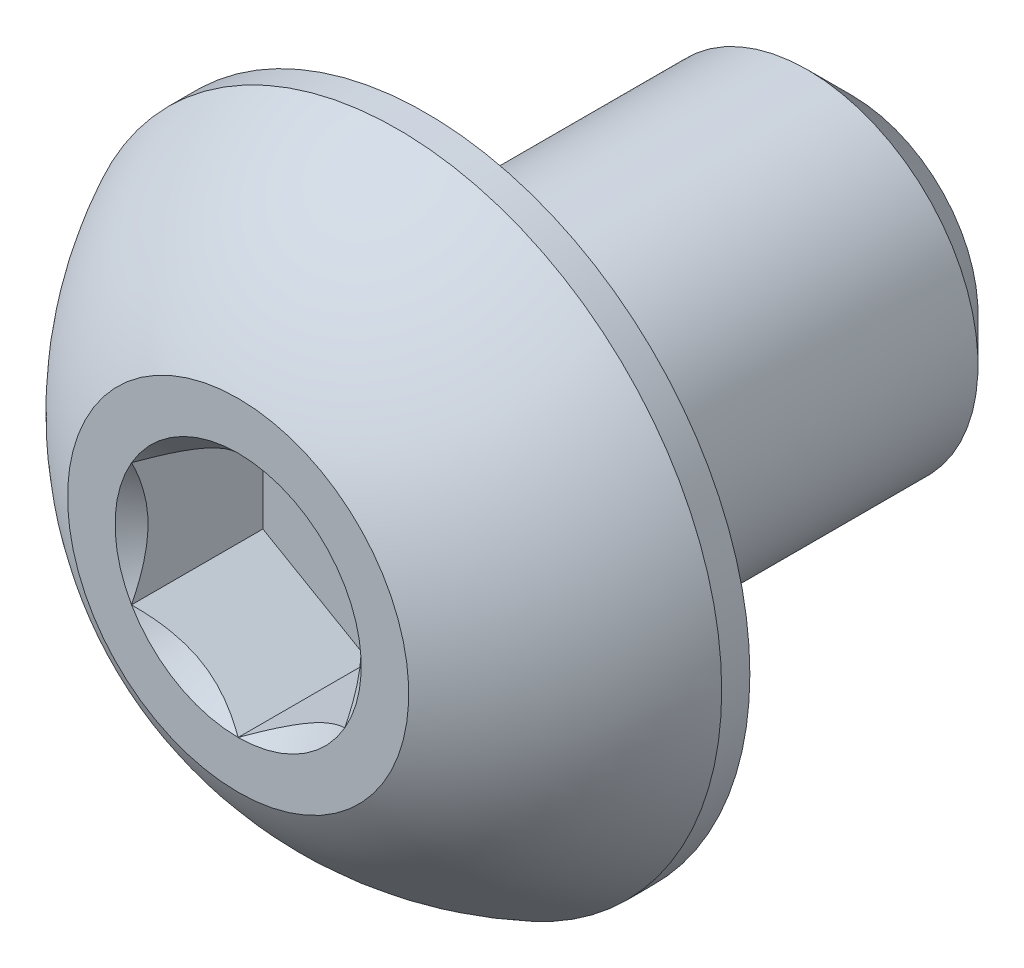
ISO-10303-21;
HEADER;
FILE_DESCRIPTION(('STEP AP214'),'2;1');
FILE_NAME('part.step','',(''),(''),'','','');
FILE_SCHEMA(('AUTOMOTIVE_DESIGN { 1 0 10303 214 1 1 1 1 }'));
ENDSEC;
DATA;
#1=APPLICATION_CONTEXT('core data for automotive mechanical design processes');
#2=APPLICATION_PROTOCOL_DEFINITION('international standard','automotive_design',2000,#1);
#3=PRODUCT_CONTEXT('',#1,'mechanical');
#4=PRODUCT('Part','Part','',(#3));
#5=PRODUCT_RELATED_PRODUCT_CATEGORY('part','',(#4));
#6=PRODUCT_DEFINITION_FORMATION('','',#4);
#7=PRODUCT_DEFINITION_CONTEXT('part definition',#1,'design');
#8=PRODUCT_DEFINITION('design','',#6,#7);
#9=PRODUCT_DEFINITION_SHAPE('','',#8);
#10=(LENGTH_UNIT() NAMED_UNIT(*) SI_UNIT(.MILLI.,.METRE.));
#11=(NAMED_UNIT(*) PLANE_ANGLE_UNIT() SI_UNIT($,.RADIAN.));
#12=(NAMED_UNIT(*) SI_UNIT($,.STERADIAN.) SOLID_ANGLE_UNIT());
#13=UNCERTAINTY_MEASURE_WITH_UNIT(LENGTH_MEASURE(1.E-05),#10,'distance_accuracy_value','');
#14=(GEOMETRIC_REPRESENTATION_CONTEXT(3) GLOBAL_UNCERTAINTY_ASSIGNED_CONTEXT((#13)) GLOBAL_UNIT_ASSIGNED_CONTEXT((#10,
#11,#12)) REPRESENTATION_CONTEXT('',''));
#15=CARTESIAN_POINT('',(0.,0.,0.));
#16=DIRECTION('',(0.,0.,1.));
#17=DIRECTION('',(1.,0.,0.));
#18=AXIS2_PLACEMENT_3D('',#15,#16,#17);
#19=CARTESIAN_POINT('',(0.,-2.,-7.2));
#20=DIRECTION('',(0.,0.,-1.));
#21=DIRECTION('',(0.,1.,0.));
#22=AXIS2_PLACEMENT_3D('',#19,#20,#21);
#23=PLANE('',#22);
#24=CARTESIAN_POINT('',(0.,0.,-7.2));
#25=DIRECTION('',(0.,0.,-1.));
#26=DIRECTION('',(0.,1.,0.));
#27=AXIS2_PLACEMENT_3D('',#24,#25,#26);
#28=CIRCLE('',#27,1.475);
#29=CARTESIAN_POINT('',(0.,1.475,-7.2));
#30=VERTEX_POINT('',#29);
#31=EDGE_CURVE('E177',#30,#30,#28,.T.);
#32=ORIENTED_EDGE('',*,*,#31,.T.);
#33=EDGE_LOOP('',(#32));
#34=FACE_BOUND('',#33,.T.);
#35=ADVANCED_FACE('F37',(#34),#23,.T.);
#36=CARTESIAN_POINT('',(0.,0.,-7.2));
#37=DIRECTION('',(0.,0.,-1.));
#38=DIRECTION('',(0.,1.,0.));
#39=AXIS2_PLACEMENT_3D('',#36,#37,#38);
#40=CYLINDRICAL_SURFACE('',#39,2.);
#41=CARTESIAN_POINT('',(0.,0.,-6.675));
#42=DIRECTION('',(0.,0.,-1.));
#43=DIRECTION('',(0.,1.,0.));
#44=AXIS2_PLACEMENT_3D('',#41,#42,#43);
#45=CIRCLE('',#44,2.);
#46=CARTESIAN_POINT('',(0.,2.,-6.675));
#47=VERTEX_POINT('',#46);
#48=EDGE_CURVE('E51',#47,#47,#45,.F.);
#49=ORIENTED_EDGE('',*,*,#48,.T.);
#50=EDGE_LOOP('',(#49));
#51=FACE_BOUND('',#50,.T.);
#52=CARTESIAN_POINT('',(0.,0.,-2.2));
#53=DIRECTION('',(0.,0.,1.));
#54=DIRECTION('',(1.,0.,0.));
#55=AXIS2_PLACEMENT_3D('',#52,#53,#54);
#56=CIRCLE('',#55,2.);
#57=CARTESIAN_POINT('',(2.,0.,-2.2));
#58=VERTEX_POINT('',#57);
#59=EDGE_CURVE('E174',#58,#58,#56,.F.);
#60=ORIENTED_EDGE('',*,*,#59,.T.);
#61=EDGE_LOOP('',(#60));
#62=FACE_BOUND('',#61,.T.);
#63=ADVANCED_FACE('F182',(#51,#62),#40,.T.);
#64=CARTESIAN_POINT('',(0.,0.,-7.2));
#65=DIRECTION('',(0.,0.,1.));
#66=DIRECTION('',(0.,-1.,0.));
#67=AXIS2_PLACEMENT_3D('',#64,#65,#66);
#68=CONICAL_SURFACE('',#67,1.475,0.785398163397447);
#69=ORIENTED_EDGE('',*,*,#48,.F.);
#70=EDGE_LOOP('',(#69));
#71=FACE_BOUND('',#70,.T.);
#72=ORIENTED_EDGE('',*,*,#31,.F.);
#73=EDGE_LOOP('',(#72));
#74=FACE_BOUND('',#73,.T.);
#75=ADVANCED_FACE('F39',(#71,#74),#68,.T.);
#76=CARTESIAN_POINT('',(0.,0.,-3.72644385026738));
#77=DIRECTION('',(0.,0.,1.));
#78=DIRECTION('',(0.,-1.,0.));
#79=AXIS2_PLACEMENT_3D('',#76,#77,#78);
#80=SPHERICAL_SURFACE('',#79,4.22922968981298);
#81=CARTESIAN_POINT('',(0.,0.,0.));
#82=DIRECTION('',(0.,0.,1.));
#83=DIRECTION('',(1.,0.,0.));
#84=AXIS2_PLACEMENT_3D('',#81,#82,#83);
#85=CIRCLE('',#84,2.);
#86=CARTESIAN_POINT('',(0.,-2.,0.));
#87=VERTEX_POINT('',#86);
#88=EDGE_CURVE('E171',#87,#87,#85,.T.);
#89=CARTESIAN_POINT('',(0.,0.,-1.87));
#90=DIRECTION('',(0.,0.,1.));
#91=DIRECTION('',(1.,0.,0.));
#92=AXIS2_PLACEMENT_3D('',#89,#90,#91);
#93=CIRCLE('',#92,3.8);
#94=CARTESIAN_POINT('',(0.,-3.8,-1.87));
#95=VERTEX_POINT('',#94);
#96=EDGE_CURVE('E165',#95,#95,#93,.T.);
#97=CARTESIAN_POINT('',(0.,-2.,0.));
#98=CARTESIAN_POINT('',(0.,-2.02421343985614,-0.0129954259644875));
#99=CARTESIAN_POINT('',(0.,-2.04830018323974,-0.0262269129651304));
#100=CARTESIAN_POINT('',(0.,-2.09621120342126,-0.0531568415057494));
#101=CARTESIAN_POINT('',(0.,-2.12003548021917,-0.0668552830457255));
#102=CARTESIAN_POINT('',(0.,-2.16741249358867,-0.0947139531320317));
#103=CARTESIAN_POINT('',(0.,-2.19096523016026,-0.108874181678362));
#104=CARTESIAN_POINT('',(0.,-2.23779021933683,-0.137651035235957));
#105=CARTESIAN_POINT('',(0.,-2.26106247194181,-0.152267660247222));
#106=CARTESIAN_POINT('',(0.,-2.30731764886072,-0.181951755514141));
#107=CARTESIAN_POINT('',(0.,-2.33030057317465,-0.197019225769796));
#108=CARTESIAN_POINT('',(0.,-2.37596836104235,-0.227599285582871));
#109=CARTESIAN_POINT('',(0.,-2.39865322459612,-0.243111875140292));
#110=CARTESIAN_POINT('',(0.,-2.44371627121513,-0.274576279395883));
#111=CARTESIAN_POINT('',(0.,-2.46609445428038,-0.290528094094053));
#112=CARTESIAN_POINT('',(0.,-2.51053563686181,-0.322864887331672));
#113=CARTESIAN_POINT('',(0.,-2.53259863637801,-0.339249865871121));
#114=CARTESIAN_POINT('',(0.,-2.57640106852492,-0.372446760967231));
#115=CARTESIAN_POINT('',(0.,-2.59814050115564,-0.389258677523892));
#116=CARTESIAN_POINT('',(0.,-2.64128753915153,-0.423303060588147));
#117=CARTESIAN_POINT('',(0.,-2.66269514451671,-0.440535527095742));
#118=CARTESIAN_POINT('',(0.,-2.70517039368395,-0.475414462202967));
#119=CARTESIAN_POINT('',(0.,-2.72623803748602,-0.493060930802597));
#120=CARTESIAN_POINT('',(0.,-2.76802535840619,-0.528761164924409));
#121=CARTESIAN_POINT('',(0.,-2.78874503552428,-0.54681493044659));
#122=CARTESIAN_POINT('',(0.,-2.82982855017313,-0.583322898482807));
#123=CARTESIAN_POINT('',(0.,-2.85019238770389,-0.601777100996844));
#124=CARTESIAN_POINT('',(0.,-2.89055648548394,-0.639078930931023));
#125=CARTESIAN_POINT('',(0.,-2.91055674573324,-0.657926558351166));
#126=CARTESIAN_POINT('',(0.,-2.95018608940553,-0.696008076521266));
#127=CARTESIAN_POINT('',(0.,-2.96981517282852,-0.715241967271224));
#128=CARTESIAN_POINT('',(0.,-3.00869470434027,-0.754088703755294));
#129=CARTESIAN_POINT('',(0.,-3.02794515242903,-0.773701549489405));
#130=CARTESIAN_POINT('',(0.,-3.06606009863533,-0.813298743603725));
#131=CARTESIAN_POINT('',(0.,-3.08492459675287,-0.833283091983934));
#132=CARTESIAN_POINT('',(0.,-3.12226047503002,-0.873615697891678));
#133=CARTESIAN_POINT('',(0.,-3.14073185518965,-0.893963955419212));
#134=CARTESIAN_POINT('',(0.,-3.17727447893821,-0.935016647847443));
#135=CARTESIAN_POINT('',(0.,-3.19534572252715,-0.955721082748139));
#136=CARTESIAN_POINT('',(0.,-3.23108120656242,-0.997478262810989));
#137=CARTESIAN_POINT('',(0.,-3.24874544700875,-1.01853100797314));
#138=CARTESIAN_POINT('',(0.,-3.28366021283673,-1.06097680909897));
#139=CARTESIAN_POINT('',(0.,-3.30091073821839,-1.08236986506264));
#140=CARTESIAN_POINT('',(0.,-3.33499151919534,-1.12548815902283));
#141=CARTESIAN_POINT('',(0.,-3.35182177479064,-1.14721339701936));
#142=CARTESIAN_POINT('',(0.,-3.38505562116371,-1.1909878000568));
#143=CARTESIAN_POINT('',(0.,-3.40145921194149,-1.21303696509771));
#144=CARTESIAN_POINT('',(0.,-3.43383349577047,-1.25745084415152));
#145=CARTESIAN_POINT('',(0.,-3.44980418882166,-1.27981555816441));
#146=CARTESIAN_POINT('',(0.,-3.48130660877275,-1.32485203719233));
#147=CARTESIAN_POINT('',(0.,-3.49683833567264,-1.34752380220736));
#148=CARTESIAN_POINT('',(0.,-3.52745692170931,-1.39316576858967));
#149=CARTESIAN_POINT('',(0.,-3.5425437808461,-1.41613596995694));
#150=CARTESIAN_POINT('',(0.,-3.57226689871518,-1.46236608103065));
#151=CARTESIAN_POINT('',(0.,-3.58690315744748,-1.48562599073709));
#152=CARTESIAN_POINT('',(0.,-3.61571951333199,-1.5324266802666));
#153=CARTESIAN_POINT('',(0.,-3.62989961048422,-1.55596746008967));
#154=CARTESIAN_POINT('',(0.,-3.65779825442823,-1.6033209453859));
#155=CARTESIAN_POINT('',(0.,-3.67151680122002,-1.62713365085906));
#156=CARTESIAN_POINT('',(0.,-3.69848713452321,-1.67502193787766));
#157=CARTESIAN_POINT('',(0.,-3.71173892103461,-1.6990975194231));
#158=CARTESIAN_POINT('',(0.,-3.73777068821038,-1.74750241579215));
#159=CARTESIAN_POINT('',(0.,-3.75055066887474,-1.77183173061575));
#160=CARTESIAN_POINT('',(0.,-3.77563400658953,-1.82073482944519));
#161=CARTESIAN_POINT('',(0.,-3.78793736363997,-1.84530861345103));
#162=CARTESIAN_POINT('',(0.,-3.8,-1.87));
#163=B_SPLINE_CURVE_WITH_KNOTS('',3,(#97,#98,#99,#100,#101,#102,#103,#104,#105,#106,#107,#108,
#109,#110,#111,#112,#113,#114,#115,#116,#117,#118,#119,#120,#121,#122,#123,#124,#125,#126,#127,
#128,#129,#130,#131,#132,#133,#134,#135,#136,#137,#138,#139,#140,#141,#142,#143,#144,#145,#146,
#147,#148,#149,#150,#151,#152,#153,#154,#155,#156,#157,#158,#159,#160,#161,#162),.UNSPECIFIED.,
.F.,.F.,(4,2,2,2,2,2,2,2,2,2,2,2,2,2,2,2,2,2,2,2,2,2,2,2,2,2,2,2,2,2,2,2,4),(0.,
0.082439858910264,0.164879717820529,0.247319576730793,0.329759435641057,0.412199294551322,
0.494639153461586,0.57707901237185,0.659518871282114,0.741958730192378,0.824398589102643,
0.906838448012907,0.989278306923171,1.07171816583344,1.1541580247437,1.23659788365396,
1.31903774256423,1.40147760147449,1.48391746038476,1.56635731929502,1.64879717820529,
1.73123703711555,1.81367689602581,1.89611675493608,1.97855661384634,2.06099647275661,
2.14343633166687,2.22587619057714,2.3083160494874,2.39075590839766,2.47319576730793,
2.55563562621819,2.63807548512846),.UNSPECIFIED.);
#164=EDGE_CURVE('BSEAM187',#87,#95,#163,.T.);
#165=ORIENTED_EDGE('',*,*,#88,.F.);
#166=ORIENTED_EDGE('',*,*,#96,.T.);
#167=ORIENTED_EDGE('',*,*,#164,.T.);
#168=ORIENTED_EDGE('',*,*,#164,.F.);
#169=EDGE_LOOP('',(#165,#167,#166,#168));
#170=FACE_BOUND('',#169,.T.);
#171=ADVANCED_FACE('F187',(#170),#80,.T.);
#172=CARTESIAN_POINT('',(0.,-2.,0.));
#173=DIRECTION('',(0.,0.,-1.));
#174=DIRECTION('',(-1.,0.,0.));
#175=AXIS2_PLACEMENT_3D('',#172,#173,#174);
#176=PLANE('',#175);
#177=CARTESIAN_POINT('',(0.,0.,0.));
#178=DIRECTION('',(0.,0.,1.));
#179=DIRECTION('',(1.,0.,0.));
#180=AXIS2_PLACEMENT_3D('',#177,#178,#179);
#181=CIRCLE('',#180,1.44337567297406);
#182=CARTESIAN_POINT('',(-1.25,0.721687836487032,0.));
#183=VERTEX_POINT('',#182);
#184=CARTESIAN_POINT('',(-1.25,-0.721687836487033,0.));
#185=VERTEX_POINT('',#184);
#186=EDGE_CURVE('E64',#183,#185,#181,.T.);
#187=ORIENTED_EDGE('',*,*,#186,.F.);
#188=CARTESIAN_POINT('',(0.,1.44337567297406,0.));
#189=VERTEX_POINT('',#188);
#190=EDGE_CURVE('E136',#189,#183,#181,.T.);
#191=ORIENTED_EDGE('',*,*,#190,.F.);
#192=CARTESIAN_POINT('',(1.25,0.721687836487033,0.));
#193=VERTEX_POINT('',#192);
#194=EDGE_CURVE('E133',#193,#189,#181,.T.);
#195=ORIENTED_EDGE('',*,*,#194,.F.);
#196=CARTESIAN_POINT('',(1.25,-0.721687836487033,0.));
#197=VERTEX_POINT('',#196);
#198=EDGE_CURVE('E104',#197,#193,#181,.T.);
#199=ORIENTED_EDGE('',*,*,#198,.F.);
#200=CARTESIAN_POINT('',(0.,-1.44337567297406,0.));
#201=VERTEX_POINT('',#200);
#202=EDGE_CURVE('E96',#201,#197,#181,.T.);
#203=ORIENTED_EDGE('',*,*,#202,.F.);
#204=EDGE_CURVE('E57',#185,#201,#181,.T.);
#205=ORIENTED_EDGE('',*,*,#204,.F.);
#206=EDGE_LOOP('',(#187,#191,#195,#199,#203,#205));
#207=FACE_BOUND('',#206,.T.);
#208=ORIENTED_EDGE('',*,*,#88,.T.);
#209=EDGE_LOOP('',(#208));
#210=FACE_BOUND('',#209,.T.);
#211=ADVANCED_FACE('F130',(#207,#210),#176,.F.);
#212=CARTESIAN_POINT('',(0.,-3.8,-2.2));
#213=DIRECTION('',(0.,0.,1.));
#214=DIRECTION('',(1.,0.,0.));
#215=AXIS2_PLACEMENT_3D('',#212,#213,#214);
#216=PLANE('',#215);
#217=ORIENTED_EDGE('',*,*,#59,.F.);
#218=EDGE_LOOP('',(#217));
#219=FACE_BOUND('',#218,.T.);
#220=CARTESIAN_POINT('',(0.,0.,-2.2));
#221=DIRECTION('',(0.,0.,1.));
#222=DIRECTION('',(1.,0.,0.));
#223=AXIS2_PLACEMENT_3D('',#220,#221,#222);
#224=CIRCLE('',#223,3.8);
#225=CARTESIAN_POINT('',(3.8,0.,-2.2));
#226=VERTEX_POINT('',#225);
#227=EDGE_CURVE('E168',#226,#226,#224,.T.);
#228=ORIENTED_EDGE('',*,*,#227,.F.);
#229=EDGE_LOOP('',(#228));
#230=FACE_BOUND('',#229,.T.);
#231=ADVANCED_FACE('F201',(#219,#230),#216,.F.);
#232=CARTESIAN_POINT('',(0.,0.,0.));
#233=DIRECTION('',(0.,0.,1.));
#234=DIRECTION('',(1.,0.,0.));
#235=AXIS2_PLACEMENT_3D('',#232,#233,#234);
#236=CYLINDRICAL_SURFACE('',#235,3.8);
#237=ORIENTED_EDGE('',*,*,#96,.F.);
#238=EDGE_LOOP('',(#237));
#239=FACE_BOUND('',#238,.T.);
#240=ORIENTED_EDGE('',*,*,#227,.T.);
#241=EDGE_LOOP('',(#240));
#242=FACE_BOUND('',#241,.T.);
#243=ADVANCED_FACE('F204',(#239,#242),#236,.T.);
#244=CARTESIAN_POINT('',(0.,0.,0.));
#245=DIRECTION('',(0.,0.,1.));
#246=DIRECTION('',(1.,0.,0.));
#247=AXIS2_PLACEMENT_3D('',#244,#245,#246);
#248=CONICAL_SURFACE('',#247,1.44337567297406,0.78539816339745);
#249=ORIENTED_EDGE('',*,*,#198,.T.);
#250=CARTESIAN_POINT('',(1.25,-1.43934010808077,0.462982096892326));
#251=CARTESIAN_POINT('',(1.25,-1.40429313005659,0.436524922632888));
#252=CARTESIAN_POINT('',(1.25,-1.36905087135599,0.410327160354278));
#253=CARTESIAN_POINT('',(1.25,-1.29809650706311,0.358557571839583));
#254=CARTESIAN_POINT('',(1.25,-1.26238428576495,0.332985904356292));
#255=CARTESIAN_POINT('',(1.25,-1.15390111792708,0.257005993689463));
#256=CARTESIAN_POINT('',(1.25,-1.08031646726264,0.207740286189565));
#257=CARTESIAN_POINT('',(1.25,-0.926012322755094,0.111025830263131));
#258=CARTESIAN_POINT('',(1.25,-0.845125318656146,0.0638412989417953));
#259=CARTESIAN_POINT('',(1.25,-0.679311174076601,-0.0224692656095874));
#260=CARTESIAN_POINT('',(1.25,-0.594398891026687,-0.0616224653731002));
#261=CARTESIAN_POINT('',(1.25,-0.46694481246074,-0.109522776311708));
#262=CARTESIAN_POINT('',(1.25,-0.426289985812821,-0.123270510213664));
#263=CARTESIAN_POINT('',(1.25,-0.343998850091267,-0.147502072549458));
#264=CARTESIAN_POINT('',(1.25,-0.302362473614962,-0.157985676130228));
#265=CARTESIAN_POINT('',(1.25,-0.219052696285665,-0.174969838251703));
#266=CARTESIAN_POINT('',(1.25,-0.177393428474499,-0.181538639528632));
#267=CARTESIAN_POINT('',(1.25,-0.0936293693401918,-0.190564946542241));
#268=CARTESIAN_POINT('',(1.25,-0.0515246558543956,-0.193023159002733));
#269=CARTESIAN_POINT('',(1.25,0.031189057630632,-0.193645937986716));
#270=CARTESIAN_POINT('',(1.25,0.0717969625499308,-0.191962883153754));
#271=CARTESIAN_POINT('',(1.25,0.152668636885198,-0.184731729402087));
#272=CARTESIAN_POINT('',(1.25,0.192932338835358,-0.179182889586893));
#273=CARTESIAN_POINT('',(1.25,0.273499879165296,-0.164428963535047));
#274=CARTESIAN_POINT('',(1.25,0.313792180618512,-0.155161824035895));
#275=CARTESIAN_POINT('',(1.25,0.393496413911458,-0.133463821542653));
#276=CARTESIAN_POINT('',(1.25,0.432908419115059,-0.121033223269356));
#277=CARTESIAN_POINT('',(1.25,0.556992735862298,-0.0772206470685631));
#278=CARTESIAN_POINT('',(1.25,0.639898924666086,-0.0408489271240444));
#279=CARTESIAN_POINT('',(1.25,0.801816555499702,0.0400191621783347));
#280=CARTESIAN_POINT('',(1.25,0.880812666325045,0.0845447209119858));
#281=CARTESIAN_POINT('',(1.25,1.0317856127975,0.176404876666625));
#282=CARTESIAN_POINT('',(1.25,1.10391618485086,0.223489933916249));
#283=CARTESIAN_POINT('',(1.25,1.21018606043311,0.296278561598538));
#284=CARTESIAN_POINT('',(1.25,1.24515069969379,0.320798085393358));
#285=CARTESIAN_POINT('',(1.25,1.31460220852737,0.37048563676568));
#286=CARTESIAN_POINT('',(1.25,1.34908920596618,0.39565348541552));
#287=CARTESIAN_POINT('',(1.25,1.38337731682912,0.421090148841213));
#288=B_SPLINE_CURVE_WITH_KNOTS('',3,(#250,#251,#252,#253,#254,#255,#256,#257,#258,#259,#260,
#261,#262,#263,#264,#265,#266,#267,#268,#269,#270,#271,#272,#273,#274,#275,#276,#277,#278,#279,
#280,#281,#282,#283,#284,#285,#286,#287),.UNSPECIFIED.,.F.,.F.,(4,2,2,2,2,2,2,2,2,2,2,2,2,2,2,2,
2,2,4),(0.,0.131732960381448,0.263498984161645,0.529042014455825,0.809741926134618,
1.08947609717225,1.21811634272576,1.346765447839,1.47310084517844,1.59941451973784,
1.72115042167849,1.84290966131735,1.96679153905341,2.09066305366039,2.36146692896009,
2.63325989198491,2.89154668212279,3.01965734507713,3.14773302245628),.UNSPECIFIED.);
#289=EDGE_CURVE('E11',#197,#193,#288,.T.);
#290=ORIENTED_EDGE('',*,*,#289,.F.);
#291=EDGE_LOOP('',(#249,#290));
#292=FACE_BOUND('',#291,.T.);
#293=ADVANCED_FACE('F108',(#292),#248,.F.);
#294=ORIENTED_EDGE('',*,*,#194,.T.);
#295=CARTESIAN_POINT('',(1.2502,0.721572366433195,0.000115483909135805));
#296=CARTESIAN_POINT('',(1.20722483292841,0.746384090710444,-0.0246783319448963));
#297=CARTESIAN_POINT('',(1.16353099525405,0.771610739653665,-0.0480162655813165));
#298=CARTESIAN_POINT('',(1.07443406915806,0.823050873919155,-0.0907479959154635));
#299=CARTESIAN_POINT('',(1.02902250164294,0.849269254648333,-0.110118007639586));
#300=CARTESIAN_POINT('',(0.93745217906474,0.902137405038636,-0.143299516586523));
#301=CARTESIAN_POINT('',(0.891316759824115,0.928773701756387,-0.157194440947344));
#302=CARTESIAN_POINT('',(0.798029919592408,0.982632884076013,-0.178602717839361));
#303=CARTESIAN_POINT('',(0.75088135086362,1.00985412292348,-0.186132058433213));
#304=CARTESIAN_POINT('',(0.669626443112748,1.05676666578643,-0.192925501949297));
#305=CARTESIAN_POINT('',(0.635625123372059,1.07639733689152,-0.19393144089565));
#306=CARTESIAN_POINT('',(0.567682235567522,1.11562418145499,-0.192238585088681));
#307=CARTESIAN_POINT('',(0.533740682344342,1.1352203463451,-0.189538972784462));
#308=CARTESIAN_POINT('',(0.4661851435425,1.1742235548576,-0.180591069683623));
#309=CARTESIAN_POINT('',(0.432571492713225,1.19363040521233,-0.174339474100294));
#310=CARTESIAN_POINT('',(0.365905361782187,1.23212011385119,-0.158624318586096));
#311=CARTESIAN_POINT('',(0.332853128969704,1.2512028293628,-0.149159379912542));
#312=CARTESIAN_POINT('',(0.248200308399735,1.30007715810653,-0.121068609312415));
#313=CARTESIAN_POINT('',(0.197133507570361,1.32956058931202,-0.1003298425478));
#314=CARTESIAN_POINT('',(0.096999145886745,1.38737318998519,-0.0536128653285236));
#315=CARTESIAN_POINT('',(0.0479256884217304,1.41570576386268,-0.0276517040532337));
#316=CARTESIAN_POINT('',(-0.000200000000000449,1.4434911430279,0.000115483909135928));
#317=B_SPLINE_CURVE_WITH_KNOTS('',3,(#295,#296,#297,#298,#299,#300,#301,#302,#303,#304,#305,
#306,#307,#308,#309,#310,#311,#312,#313,#314,#315,#316),.UNSPECIFIED.,.F.,.F.,(4,2,2,2,2,2,2,2,
2,2,4),(0.,0.166533409618304,0.334037607289761,0.498880396489698,0.663307919240274,
0.780963963458827,0.898645970148453,1.01643764860773,1.13427993171549,1.32148652032141,
1.50809158792574),.UNSPECIFIED.);
#318=EDGE_CURVE('E135',#193,#189,#317,.T.);
#319=ORIENTED_EDGE('',*,*,#318,.F.);
#320=EDGE_LOOP('',(#294,#319));
#321=FACE_BOUND('',#320,.T.);
#322=ADVANCED_FACE('F289',(#321),#248,.F.);
#323=ORIENTED_EDGE('',*,*,#190,.T.);
#324=CARTESIAN_POINT('',(0.000199999999999598,1.4434911430279,0.000115483909135892));
#325=CARTESIAN_POINT('',(-0.0427751670715871,1.41867941875065,-0.0246783319448964));
#326=CARTESIAN_POINT('',(-0.0864690047459485,1.39345276980743,-0.0480162655813165));
#327=CARTESIAN_POINT('',(-0.175565930841942,1.34201263554194,-0.0907479959154634));
#328=CARTESIAN_POINT('',(-0.220977498357064,1.31579425481276,-0.110118007639586));
#329=CARTESIAN_POINT('',(-0.31254782093526,1.26292610442246,-0.143299516586523));
#330=CARTESIAN_POINT('',(-0.358683240175886,1.23628980770471,-0.157194440947344));
#331=CARTESIAN_POINT('',(-0.451970080407593,1.18243062538508,-0.178602717839361));
#332=CARTESIAN_POINT('',(-0.49911864913638,1.15520938653761,-0.186132058433213));
#333=CARTESIAN_POINT('',(-0.580373556887252,1.10829684367467,-0.192925501949297));
#334=CARTESIAN_POINT('',(-0.614374876627941,1.08866617256958,-0.193931440895651));
#335=CARTESIAN_POINT('',(-0.682317764432477,1.04943932800611,-0.192238585088682));
#336=CARTESIAN_POINT('',(-0.716259317655658,1.02984316311599,-0.189538972784462));
#337=CARTESIAN_POINT('',(-0.7838148564575,0.990839954603499,-0.180591069683623));
#338=CARTESIAN_POINT('',(-0.817428507286775,0.971433104248771,-0.174339474100295));
#339=CARTESIAN_POINT('',(-0.884094638217813,0.932943395609905,-0.158624318586096));
#340=CARTESIAN_POINT('',(-0.917146871030295,0.9138606800983,-0.149159379912542));
#341=CARTESIAN_POINT('',(-1.00179969160026,0.864986351354568,-0.121068609312415));
#342=CARTESIAN_POINT('',(-1.05286649242964,0.835502920149076,-0.1003298425478));
#343=CARTESIAN_POINT('',(-1.15300085411325,0.777690319475908,-0.0536128653285243));
#344=CARTESIAN_POINT('',(-1.20207431157827,0.749357745598417,-0.0276517040532345));
#345=CARTESIAN_POINT('',(-1.2502,0.721572366433194,0.000115483909135271));
#346=B_SPLINE_CURVE_WITH_KNOTS('',3,(#324,#325,#326,#327,#328,#329,#330,#331,#332,#333,#334,
#335,#336,#337,#338,#339,#340,#341,#342,#343,#344,#345),.UNSPECIFIED.,.F.,.F.,(4,2,2,2,2,2,2,2,
2,2,4),(0.,0.166533409618304,0.334037607289762,0.498880396489698,0.663307919240274,
0.780963963458826,0.898645970148453,1.01643764860773,1.13427993171549,1.32148652032141,
1.50809158792573),.UNSPECIFIED.);
#347=EDGE_CURVE('E140',#189,#183,#346,.T.);
#348=ORIENTED_EDGE('',*,*,#347,.F.);
#349=EDGE_LOOP('',(#323,#348));
#350=FACE_BOUND('',#349,.T.);
#351=ADVANCED_FACE('F143',(#350),#248,.F.);
#352=ORIENTED_EDGE('',*,*,#186,.T.);
#353=CARTESIAN_POINT('',(-1.25,-1.43934010808077,0.462982096892326));
#354=CARTESIAN_POINT('',(-1.25,-1.40429313005659,0.436524922632889));
#355=CARTESIAN_POINT('',(-1.25,-1.36905087135599,0.410327160354279));
#356=CARTESIAN_POINT('',(-1.25,-1.29809650706311,0.358557571839584));
#357=CARTESIAN_POINT('',(-1.25,-1.26238428576495,0.332985904356293));
#358=CARTESIAN_POINT('',(-1.25,-1.15390111792708,0.257005993689463));
#359=CARTESIAN_POINT('',(-1.25,-1.08031646726264,0.207740286189566));
#360=CARTESIAN_POINT('',(-1.25,-0.926012322755095,0.111025830263131));
#361=CARTESIAN_POINT('',(-1.25,-0.845125318656147,0.0638412989417958));
#362=CARTESIAN_POINT('',(-1.25,-0.679311174076602,-0.0224692656095871));
#363=CARTESIAN_POINT('',(-1.25,-0.594398891026688,-0.0616224653731003));
#364=CARTESIAN_POINT('',(-1.25,-0.46694481246074,-0.109522776311708));
#365=CARTESIAN_POINT('',(-1.25,-0.426289985812822,-0.123270510213664));
#366=CARTESIAN_POINT('',(-1.25,-0.343998850091268,-0.147502072549458));
#367=CARTESIAN_POINT('',(-1.25,-0.302362473614962,-0.157985676130229));
#368=CARTESIAN_POINT('',(-1.25,-0.219052696285665,-0.174969838251704));
#369=CARTESIAN_POINT('',(-1.25,-0.1773934284745,-0.181538639528632));
#370=CARTESIAN_POINT('',(-1.25,-0.0936293693401919,-0.190564946542242));
#371=CARTESIAN_POINT('',(-1.25,-0.0515246558543958,-0.193023159002733));
#372=CARTESIAN_POINT('',(-1.25,0.0311890576306318,-0.193645937986716));
#373=CARTESIAN_POINT('',(-1.25,0.0717969625499307,-0.191962883153754));
#374=CARTESIAN_POINT('',(-1.25,0.152668636885197,-0.184731729402087));
#375=CARTESIAN_POINT('',(-1.25,0.192932338835358,-0.179182889586893));
#376=CARTESIAN_POINT('',(-1.25,0.273499879165295,-0.164428963535047));
#377=CARTESIAN_POINT('',(-1.25,0.313792180618511,-0.155161824035895));
#378=CARTESIAN_POINT('',(-1.25,0.393496413911457,-0.133463821542654));
#379=CARTESIAN_POINT('',(-1.25,0.432908419115059,-0.121033223269356));
#380=CARTESIAN_POINT('',(-1.25,0.556992735862298,-0.0772206470685638));
#381=CARTESIAN_POINT('',(-1.25,0.639898924666086,-0.040848927124045));
#382=CARTESIAN_POINT('',(-1.25,0.801816555499701,0.0400191621783341));
#383=CARTESIAN_POINT('',(-1.25,0.880812666325045,0.0845447209119852));
#384=CARTESIAN_POINT('',(-1.25,1.0317856127975,0.176404876666624));
#385=CARTESIAN_POINT('',(-1.25,1.10391618485086,0.223489933916249));
#386=CARTESIAN_POINT('',(-1.25,1.21018606043311,0.296278561598537));
#387=CARTESIAN_POINT('',(-1.25,1.24515069969379,0.320798085393358));
#388=CARTESIAN_POINT('',(-1.25,1.31460220852736,0.37048563676568));
#389=CARTESIAN_POINT('',(-1.25,1.34908920596618,0.395653485415519));
#390=CARTESIAN_POINT('',(-1.25,1.38337731682912,0.421090148841213));
#391=B_SPLINE_CURVE_WITH_KNOTS('',3,(#353,#354,#355,#356,#357,#358,#359,#360,#361,#362,#363,
#364,#365,#366,#367,#368,#369,#370,#371,#372,#373,#374,#375,#376,#377,#378,#379,#380,#381,#382,
#383,#384,#385,#386,#387,#388,#389,#390),.UNSPECIFIED.,.F.,.F.,(4,2,2,2,2,2,2,2,2,2,2,2,2,2,2,2,
2,2,4),(0.,0.131732960381448,0.263498984161645,0.529042014455825,0.809741926134618,
1.08947609717225,1.21811634272577,1.346765447839,1.47310084517844,1.59941451973784,
1.72115042167849,1.84290966131735,1.96679153905342,2.09066305366039,2.36146692896009,
2.63325989198491,2.89154668212279,3.01965734507713,3.14773302245628),.UNSPECIFIED.);
#392=EDGE_CURVE('E147',#183,#185,#391,.F.);
#393=ORIENTED_EDGE('',*,*,#392,.F.);
#394=EDGE_LOOP('',(#352,#393));
#395=FACE_BOUND('',#394,.T.);
#396=ADVANCED_FACE('F283',(#395),#248,.F.);
#397=ORIENTED_EDGE('',*,*,#204,.T.);
#398=CARTESIAN_POINT('',(-1.2502,-0.721572366433194,0.000115483909135371));
#399=CARTESIAN_POINT('',(-1.20722483292841,-0.746384090710444,-0.0246783319448969));
#400=CARTESIAN_POINT('',(-1.16353099525405,-0.771610739653664,-0.048016265581317));
#401=CARTESIAN_POINT('',(-1.07443406915806,-0.823050873919155,-0.0907479959154639));
#402=CARTESIAN_POINT('',(-1.02902250164294,-0.849269254648333,-0.110118007639587));
#403=CARTESIAN_POINT('',(-0.93745217906474,-0.902137405038635,-0.143299516586523));
#404=CARTESIAN_POINT('',(-0.891316759824114,-0.928773701756387,-0.157194440947345));
#405=CARTESIAN_POINT('',(-0.798029919592408,-0.982632884076012,-0.178602717839362));
#406=CARTESIAN_POINT('',(-0.75088135086362,-1.00985412292348,-0.186132058433214));
#407=CARTESIAN_POINT('',(-0.669626443112747,-1.05676666578643,-0.192925501949298));
#408=CARTESIAN_POINT('',(-0.635625123372059,-1.07639733689152,-0.193931440895651));
#409=CARTESIAN_POINT('',(-0.567682235567522,-1.11562418145499,-0.192238585088682));
#410=CARTESIAN_POINT('',(-0.533740682344342,-1.1352203463451,-0.189538972784463));
#411=CARTESIAN_POINT('',(-0.4661851435425,-1.1742235548576,-0.180591069683623));
#412=CARTESIAN_POINT('',(-0.432571492713225,-1.19363040521233,-0.174339474100295));
#413=CARTESIAN_POINT('',(-0.365905361782187,-1.23212011385119,-0.158624318586097));
#414=CARTESIAN_POINT('',(-0.332853128969704,-1.2512028293628,-0.149159379912542));
#415=CARTESIAN_POINT('',(-0.248200308399735,-1.30007715810653,-0.121068609312415));
#416=CARTESIAN_POINT('',(-0.197133507570362,-1.32956058931202,-0.1003298425478));
#417=CARTESIAN_POINT('',(-0.0969991458867452,-1.38737318998519,-0.0536128653285244));
#418=CARTESIAN_POINT('',(-0.0479256884217305,-1.41570576386268,-0.0276517040532346));
#419=CARTESIAN_POINT('',(0.000200000000000389,-1.4434911430279,0.000115483909135269));
#420=B_SPLINE_CURVE_WITH_KNOTS('',3,(#398,#399,#400,#401,#402,#403,#404,#405,#406,#407,#408,
#409,#410,#411,#412,#413,#414,#415,#416,#417,#418,#419),.UNSPECIFIED.,.F.,.F.,(4,2,2,2,2,2,2,2,
2,2,4),(0.,0.166533409618303,0.334037607289761,0.498880396489698,0.663307919240274,
0.780963963458826,0.898645970148453,1.01643764860773,1.13427993171549,1.32148652032141,
1.50809158792574),.UNSPECIFIED.);
#421=EDGE_CURVE('E120',#185,#201,#420,.T.);
#422=ORIENTED_EDGE('',*,*,#421,.F.);
#423=EDGE_LOOP('',(#397,#422));
#424=FACE_BOUND('',#423,.T.);
#425=ADVANCED_FACE('F231',(#424),#248,.F.);
#426=ORIENTED_EDGE('',*,*,#202,.T.);
#427=CARTESIAN_POINT('',(-0.00019999999999964,-1.4434911430279,0.000115483909135458));
#428=CARTESIAN_POINT('',(0.042775167071587,-1.41867941875065,-0.024678331944897));
#429=CARTESIAN_POINT('',(0.0864690047459483,-1.39345276980743,-0.0480162655813172));
#430=CARTESIAN_POINT('',(0.175565930841942,-1.34201263554194,-0.0907479959154639));
#431=CARTESIAN_POINT('',(0.220977498357064,-1.31579425481276,-0.110118007639587));
#432=CARTESIAN_POINT('',(0.31254782093526,-1.26292610442246,-0.143299516586523));
#433=CARTESIAN_POINT('',(0.358683240175886,-1.23628980770471,-0.157194440947345));
#434=CARTESIAN_POINT('',(0.451970080407592,-1.18243062538508,-0.178602717839362));
#435=CARTESIAN_POINT('',(0.49911864913638,-1.15520938653761,-0.186132058433214));
#436=CARTESIAN_POINT('',(0.580373556887252,-1.10829684367467,-0.192925501949298));
#437=CARTESIAN_POINT('',(0.614374876627941,-1.08866617256958,-0.193931440895651));
#438=CARTESIAN_POINT('',(0.682317764432477,-1.04943932800611,-0.192238585088682));
#439=CARTESIAN_POINT('',(0.716259317655657,-1.02984316311599,-0.189538972784463));
#440=CARTESIAN_POINT('',(0.783814856457499,-0.990839954603499,-0.180591069683623));
#441=CARTESIAN_POINT('',(0.817428507286775,-0.971433104248771,-0.174339474100295));
#442=CARTESIAN_POINT('',(0.884094638217813,-0.932943395609905,-0.158624318586097));
#443=CARTESIAN_POINT('',(0.917146871030295,-0.9138606800983,-0.149159379912543));
#444=CARTESIAN_POINT('',(1.00179969160026,-0.864986351354567,-0.121068609312415));
#445=CARTESIAN_POINT('',(1.05286649242964,-0.835502920149076,-0.1003298425478));
#446=CARTESIAN_POINT('',(1.15300085411325,-0.777690319475908,-0.0536128653285245));
#447=CARTESIAN_POINT('',(1.20207431157827,-0.749357745598416,-0.0276517040532346));
#448=CARTESIAN_POINT('',(1.2502,-0.721572366433194,0.000115483909135269));
#449=B_SPLINE_CURVE_WITH_KNOTS('',3,(#427,#428,#429,#430,#431,#432,#433,#434,#435,#436,#437,
#438,#439,#440,#441,#442,#443,#444,#445,#446,#447,#448),.UNSPECIFIED.,.F.,.F.,(4,2,2,2,2,2,2,2,
2,2,4),(0.,0.166533409618303,0.334037607289761,0.498880396489698,0.663307919240274,
0.780963963458826,0.898645970148452,1.01643764860773,1.13427993171549,1.32148652032141,
1.50809158792573),.UNSPECIFIED.);
#450=EDGE_CURVE('E100',#201,#197,#449,.T.);
#451=ORIENTED_EDGE('',*,*,#450,.F.);
#452=EDGE_LOOP('',(#426,#451));
#453=FACE_BOUND('',#452,.T.);
#454=ADVANCED_FACE('F98',(#453),#248,.F.);
#455=CARTESIAN_POINT('',(1.25,-0.721687836487032,-1.54));
#456=DIRECTION('',(0.,0.,1.));
#457=DIRECTION('',(1.,0.,0.));
#458=AXIS2_PLACEMENT_3D('',#455,#456,#457);
#459=PLANE('',#458);
#460=DIRECTION('',(0.866025403784438,0.5,0.));
#461=VECTOR('',#460,1.);
#462=CARTESIAN_POINT('',(0.,-1.44337567297406,-1.54));
#463=LINE('',#462,#461);
#464=CARTESIAN_POINT('',(0.,-1.44337567297406,-1.54));
#465=VERTEX_POINT('',#464);
#466=CARTESIAN_POINT('',(1.25,-0.721687836487032,-1.54));
#467=VERTEX_POINT('',#466);
#468=EDGE_CURVE('E119',#465,#467,#463,.T.);
#469=ORIENTED_EDGE('',*,*,#468,.T.);
#470=DIRECTION('',(0.,1.,0.));
#471=VECTOR('',#470,1.);
#472=CARTESIAN_POINT('',(1.25,-0.721687836487032,-1.54));
#473=LINE('',#472,#471);
#474=CARTESIAN_POINT('',(1.25,0.721687836487033,-1.54));
#475=VERTEX_POINT('',#474);
#476=EDGE_CURVE('E124',#467,#475,#473,.T.);
#477=ORIENTED_EDGE('',*,*,#476,.T.);
#478=DIRECTION('',(-0.866025403784439,0.5,0.));
#479=VECTOR('',#478,1.);
#480=CARTESIAN_POINT('',(1.25,0.721687836487033,-1.54));
#481=LINE('',#480,#479);
#482=CARTESIAN_POINT('',(0.,1.44337567297406,-1.54));
#483=VERTEX_POINT('',#482);
#484=EDGE_CURVE('E273',#475,#483,#481,.T.);
#485=ORIENTED_EDGE('',*,*,#484,.T.);
#486=DIRECTION('',(-0.866025403784438,-0.5,0.));
#487=VECTOR('',#486,1.);
#488=CARTESIAN_POINT('',(0.,1.44337567297406,-1.54));
#489=LINE('',#488,#487);
#490=CARTESIAN_POINT('',(-1.25,0.721687836487032,-1.54));
#491=VERTEX_POINT('',#490);
#492=EDGE_CURVE('E156',#483,#491,#489,.T.);
#493=ORIENTED_EDGE('',*,*,#492,.T.);
#494=DIRECTION('',(0.,-1.,0.));
#495=VECTOR('',#494,1.);
#496=CARTESIAN_POINT('',(-1.25,0.721687836487032,-1.54));
#497=LINE('',#496,#495);
#498=CARTESIAN_POINT('',(-1.25,-0.721687836487032,-1.54));
#499=VERTEX_POINT('',#498);
#500=EDGE_CURVE('E277',#491,#499,#497,.T.);
#501=ORIENTED_EDGE('',*,*,#500,.T.);
#502=DIRECTION('',(0.866025403784439,-0.5,0.));
#503=VECTOR('',#502,1.);
#504=CARTESIAN_POINT('',(-1.25,-0.721687836487032,-1.54));
#505=LINE('',#504,#503);
#506=EDGE_CURVE('E127',#499,#465,#505,.T.);
#507=ORIENTED_EDGE('',*,*,#506,.T.);
#508=EDGE_LOOP('',(#469,#477,#485,#493,#501,#507));
#509=FACE_BOUND('',#508,.T.);
#510=ADVANCED_FACE('F230',(#509),#459,.T.);
#511=CARTESIAN_POINT('',(1.25,-0.721687836487032,-1.54));
#512=DIRECTION('',(1.,0.,0.));
#513=DIRECTION('',(0.,0.,-1.));
#514=AXIS2_PLACEMENT_3D('',#511,#512,#513);
#515=PLANE('',#514);
#516=DIRECTION('',(0.,0.,1.));
#517=VECTOR('',#516,1.);
#518=CARTESIAN_POINT('',(1.25,-0.721687836487032,-1.54));
#519=LINE('',#518,#517);
#520=EDGE_CURVE('E116',#467,#197,#519,.T.);
#521=ORIENTED_EDGE('',*,*,#520,.T.);
#522=ORIENTED_EDGE('',*,*,#289,.T.);
#523=DIRECTION('',(0.,0.,1.));
#524=VECTOR('',#523,1.);
#525=CARTESIAN_POINT('',(1.25,0.721687836487033,-1.54));
#526=LINE('',#525,#524);
#527=EDGE_CURVE('E126',#475,#193,#526,.T.);
#528=ORIENTED_EDGE('',*,*,#527,.F.);
#529=ORIENTED_EDGE('',*,*,#476,.F.);
#530=EDGE_LOOP('',(#521,#522,#528,#529));
#531=FACE_BOUND('',#530,.T.);
#532=ADVANCED_FACE('F122',(#531),#515,.F.);
#533=CARTESIAN_POINT('',(1.25,0.721687836487033,-1.54));
#534=DIRECTION('',(0.5,0.866025403784439,0.));
#535=DIRECTION('',(-0.866025403784439,0.5,0.));
#536=AXIS2_PLACEMENT_3D('',#533,#534,#535);
#537=PLANE('',#536);
#538=ORIENTED_EDGE('',*,*,#527,.T.);
#539=ORIENTED_EDGE('',*,*,#318,.T.);
#540=DIRECTION('',(0.,0.,1.));
#541=VECTOR('',#540,1.);
#542=CARTESIAN_POINT('',(0.,1.44337567297406,-1.54));
#543=LINE('',#542,#541);
#544=EDGE_CURVE('E152',#483,#189,#543,.T.);
#545=ORIENTED_EDGE('',*,*,#544,.F.);
#546=ORIENTED_EDGE('',*,*,#484,.F.);
#547=EDGE_LOOP('',(#538,#539,#545,#546));
#548=FACE_BOUND('',#547,.T.);
#549=ADVANCED_FACE('F150',(#548),#537,.F.);
#550=CARTESIAN_POINT('',(0.,1.44337567297406,-1.54));
#551=DIRECTION('',(-0.5,0.866025403784438,0.));
#552=DIRECTION('',(-0.866025403784439,-0.5,0.));
#553=AXIS2_PLACEMENT_3D('',#550,#551,#552);
#554=PLANE('',#553);
#555=ORIENTED_EDGE('',*,*,#544,.T.);
#556=ORIENTED_EDGE('',*,*,#347,.T.);
#557=DIRECTION('',(0.,0.,1.));
#558=VECTOR('',#557,1.);
#559=CARTESIAN_POINT('',(-1.25,0.721687836487032,-1.54));
#560=LINE('',#559,#558);
#561=EDGE_CURVE('E158',#491,#183,#560,.T.);
#562=ORIENTED_EDGE('',*,*,#561,.F.);
#563=ORIENTED_EDGE('',*,*,#492,.F.);
#564=EDGE_LOOP('',(#555,#556,#562,#563));
#565=FACE_BOUND('',#564,.T.);
#566=ADVANCED_FACE('F154',(#565),#554,.F.);
#567=CARTESIAN_POINT('',(-1.25,0.721687836487032,-1.54));
#568=DIRECTION('',(-1.,0.,0.));
#569=DIRECTION('',(0.,0.,1.));
#570=AXIS2_PLACEMENT_3D('',#567,#568,#569);
#571=PLANE('',#570);
#572=ORIENTED_EDGE('',*,*,#561,.T.);
#573=ORIENTED_EDGE('',*,*,#392,.T.);
#574=DIRECTION('',(0.,0.,1.));
#575=VECTOR('',#574,1.);
#576=CARTESIAN_POINT('',(-1.25,-0.721687836487032,-1.54));
#577=LINE('',#576,#575);
#578=EDGE_CURVE('E160',#499,#185,#577,.T.);
#579=ORIENTED_EDGE('',*,*,#578,.F.);
#580=ORIENTED_EDGE('',*,*,#500,.F.);
#581=EDGE_LOOP('',(#572,#573,#579,#580));
#582=FACE_BOUND('',#581,.T.);
#583=ADVANCED_FACE('F252',(#582),#571,.F.);
#584=CARTESIAN_POINT('',(-1.25,-0.721687836487032,-1.54));
#585=DIRECTION('',(-0.5,-0.866025403784439,0.));
#586=DIRECTION('',(0.866025403784439,-0.5,0.));
#587=AXIS2_PLACEMENT_3D('',#584,#585,#586);
#588=PLANE('',#587);
#589=ORIENTED_EDGE('',*,*,#578,.T.);
#590=ORIENTED_EDGE('',*,*,#421,.T.);
#591=DIRECTION('',(0.,0.,1.));
#592=VECTOR('',#591,1.);
#593=CARTESIAN_POINT('',(0.,-1.44337567297406,-1.54));
#594=LINE('',#593,#592);
#595=EDGE_CURVE('E118',#465,#201,#594,.T.);
#596=ORIENTED_EDGE('',*,*,#595,.F.);
#597=ORIENTED_EDGE('',*,*,#506,.F.);
#598=EDGE_LOOP('',(#589,#590,#596,#597));
#599=FACE_BOUND('',#598,.T.);
#600=ADVANCED_FACE('F211',(#599),#588,.F.);
#601=CARTESIAN_POINT('',(0.,-1.44337567297406,-1.54));
#602=DIRECTION('',(0.5,-0.866025403784438,0.));
#603=DIRECTION('',(0.866025403784439,0.5,0.));
#604=AXIS2_PLACEMENT_3D('',#601,#602,#603);
#605=PLANE('',#604);
#606=ORIENTED_EDGE('',*,*,#595,.T.);
#607=ORIENTED_EDGE('',*,*,#450,.T.);
#608=ORIENTED_EDGE('',*,*,#520,.F.);
#609=ORIENTED_EDGE('',*,*,#468,.F.);
#610=EDGE_LOOP('',(#606,#607,#608,#609));
#611=FACE_BOUND('',#610,.T.);
#612=ADVANCED_FACE('F114',(#611),#605,.F.);
#613=CLOSED_SHELL('',(#35,#63,#75,#171,#211,#231,#243,#293,#322,#351,#396,#425,#454,#510,#532,
#549,#566,#583,#600,#612));
#614=MANIFOLD_SOLID_BREP('B2',#613);
#615=ADVANCED_BREP_SHAPE_REPRESENTATION('',(#18,#614),#14);
#616=SHAPE_DEFINITION_REPRESENTATION(#9,#615);
ENDSEC;
END-ISO-10303-21;
